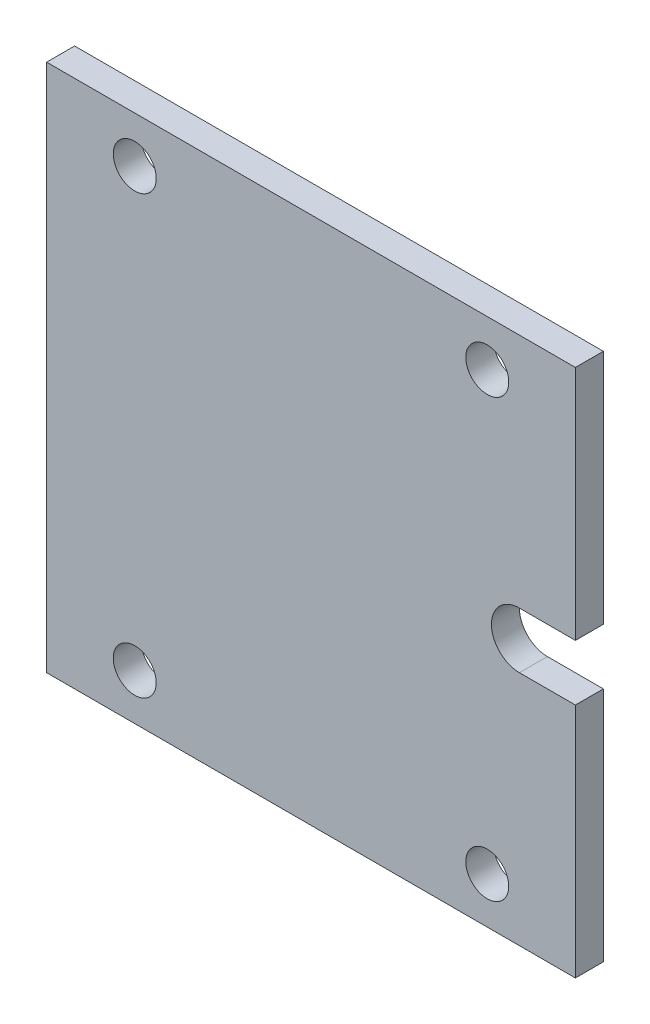
ISO-10303-21;
HEADER;
FILE_DESCRIPTION(('STEP AP214'),'2;1');
FILE_NAME('part.step','',(''),(''),'','','');
FILE_SCHEMA(('AUTOMOTIVE_DESIGN { 1 0 10303 214 1 1 1 1 }'));
ENDSEC;
DATA;
#1=APPLICATION_CONTEXT('core data for automotive mechanical design processes');
#2=APPLICATION_PROTOCOL_DEFINITION('international standard','automotive_design',2000,#1);
#3=PRODUCT_CONTEXT('',#1,'mechanical');
#4=PRODUCT('Part','Part','',(#3));
#5=PRODUCT_RELATED_PRODUCT_CATEGORY('part','',(#4));
#6=PRODUCT_DEFINITION_FORMATION('','',#4);
#7=PRODUCT_DEFINITION_CONTEXT('part definition',#1,'design');
#8=PRODUCT_DEFINITION('design','',#6,#7);
#9=PRODUCT_DEFINITION_SHAPE('','',#8);
#10=(LENGTH_UNIT() NAMED_UNIT(*) SI_UNIT(.MILLI.,.METRE.));
#11=(NAMED_UNIT(*) PLANE_ANGLE_UNIT() SI_UNIT($,.RADIAN.));
#12=(NAMED_UNIT(*) SI_UNIT($,.STERADIAN.) SOLID_ANGLE_UNIT());
#13=UNCERTAINTY_MEASURE_WITH_UNIT(LENGTH_MEASURE(1.E-05),#10,'distance_accuracy_value','');
#14=(GEOMETRIC_REPRESENTATION_CONTEXT(3) GLOBAL_UNCERTAINTY_ASSIGNED_CONTEXT((#13)) GLOBAL_UNIT_ASSIGNED_CONTEXT((#10,
#11,#12)) REPRESENTATION_CONTEXT('',''));
#15=CARTESIAN_POINT('',(0.,0.,0.));
#16=DIRECTION('',(0.,0.,1.));
#17=DIRECTION('',(1.,0.,0.));
#18=AXIS2_PLACEMENT_3D('',#15,#16,#17);
#19=CARTESIAN_POINT('',(15.,-15.,1.5875));
#20=DIRECTION('',(-1.,0.,0.));
#21=DIRECTION('',(0.,0.,1.));
#22=AXIS2_PLACEMENT_3D('',#19,#20,#21);
#23=PLANE('',#22);
#24=DIRECTION('',(0.,1.,0.));
#25=VECTOR('',#24,1.);
#26=CARTESIAN_POINT('',(15.,-15.,0.));
#27=LINE('',#26,#25);
#28=CARTESIAN_POINT('',(15.,-15.,0.));
#29=VERTEX_POINT('',#28);
#30=CARTESIAN_POINT('',(15.,-1.58749999999999,0.));
#31=VERTEX_POINT('',#30);
#32=EDGE_CURVE('E172',#29,#31,#27,.T.);
#33=ORIENTED_EDGE('',*,*,#32,.T.);
#34=DIRECTION('',(0.,0.,-1.));
#35=VECTOR('',#34,1.);
#36=CARTESIAN_POINT('',(15.,-1.58749999999999,1.5875));
#37=LINE('',#36,#35);
#38=CARTESIAN_POINT('',(15.,-1.58749999999999,1.5875));
#39=VERTEX_POINT('',#38);
#40=EDGE_CURVE('E137',#39,#31,#37,.T.);
#41=ORIENTED_EDGE('',*,*,#40,.F.);
#42=DIRECTION('',(0.,1.,0.));
#43=VECTOR('',#42,1.);
#44=CARTESIAN_POINT('',(15.,-15.,1.5875));
#45=LINE('',#44,#43);
#46=CARTESIAN_POINT('',(15.,-15.,1.5875));
#47=VERTEX_POINT('',#46);
#48=EDGE_CURVE('E164',#47,#39,#45,.T.);
#49=ORIENTED_EDGE('',*,*,#48,.F.);
#50=DIRECTION('',(0.,0.,-1.));
#51=VECTOR('',#50,1.);
#52=CARTESIAN_POINT('',(15.,-15.,1.5875));
#53=LINE('',#52,#51);
#54=EDGE_CURVE('E171',#47,#29,#53,.T.);
#55=ORIENTED_EDGE('',*,*,#54,.T.);
#56=EDGE_LOOP('',(#33,#41,#49,#55));
#57=FACE_BOUND('',#56,.T.);
#58=ADVANCED_FACE('F35',(#57),#23,.F.);
#59=CARTESIAN_POINT('',(0.,0.,1.5875));
#60=DIRECTION('',(0.,0.,-1.));
#61=DIRECTION('',(-1.,0.,0.));
#62=AXIS2_PLACEMENT_3D('',#59,#60,#61);
#63=PLANE('',#62);
#64=ORIENTED_EDGE('',*,*,#48,.T.);
#65=DIRECTION('',(-1.,0.,0.));
#66=VECTOR('',#65,1.);
#67=CARTESIAN_POINT('',(11.825,-1.58749999999999,1.5875));
#68=LINE('',#67,#66);
#69=CARTESIAN_POINT('',(11.825,-1.58749999999999,1.5875));
#70=VERTEX_POINT('',#69);
#71=EDGE_CURVE('E119',#39,#70,#68,.T.);
#72=ORIENTED_EDGE('',*,*,#71,.T.);
#73=CARTESIAN_POINT('',(11.825,0.,1.5875));
#74=DIRECTION('',(0.,0.,-1.));
#75=DIRECTION('',(-1.,0.,0.));
#76=AXIS2_PLACEMENT_3D('',#73,#74,#75);
#77=CIRCLE('',#76,1.5875);
#78=CARTESIAN_POINT('',(11.825,1.58750000000001,1.5875));
#79=VERTEX_POINT('',#78);
#80=EDGE_CURVE('E114',#70,#79,#77,.T.);
#81=ORIENTED_EDGE('',*,*,#80,.T.);
#82=DIRECTION('',(1.,0.,0.));
#83=VECTOR('',#82,1.);
#84=CARTESIAN_POINT('',(15.,1.58750000000002,1.5875));
#85=LINE('',#84,#83);
#86=CARTESIAN_POINT('',(15.,1.58750000000002,1.5875));
#87=VERTEX_POINT('',#86);
#88=EDGE_CURVE('E121',#79,#87,#85,.T.);
#89=ORIENTED_EDGE('',*,*,#88,.T.);
#90=CARTESIAN_POINT('',(15.,15.,1.5875));
#91=VERTEX_POINT('',#90);
#92=EDGE_CURVE('E87',#87,#91,#45,.T.);
#93=ORIENTED_EDGE('',*,*,#92,.T.);
#94=DIRECTION('',(-1.,0.,0.));
#95=VECTOR('',#94,1.);
#96=CARTESIAN_POINT('',(-15.,15.,1.5875));
#97=LINE('',#96,#95);
#98=CARTESIAN_POINT('',(-15.,15.,1.5875));
#99=VERTEX_POINT('',#98);
#100=EDGE_CURVE('E166',#91,#99,#97,.T.);
#101=ORIENTED_EDGE('',*,*,#100,.T.);
#102=DIRECTION('',(0.,-1.,0.));
#103=VECTOR('',#102,1.);
#104=CARTESIAN_POINT('',(-15.,-15.,1.5875));
#105=LINE('',#104,#103);
#106=CARTESIAN_POINT('',(-15.,-15.,1.5875));
#107=VERTEX_POINT('',#106);
#108=EDGE_CURVE('E168',#99,#107,#105,.T.);
#109=ORIENTED_EDGE('',*,*,#108,.T.);
#110=DIRECTION('',(1.,0.,0.));
#111=VECTOR('',#110,1.);
#112=CARTESIAN_POINT('',(-15.,-15.,1.5875));
#113=LINE('',#112,#111);
#114=EDGE_CURVE('E59',#107,#47,#113,.T.);
#115=ORIENTED_EDGE('',*,*,#114,.T.);
#116=EDGE_LOOP('',(#64,#72,#81,#89,#93,#101,#109,#115));
#117=FACE_BOUND('',#116,.T.);
#118=CARTESIAN_POINT('',(-10.,12.38905,1.5875));
#119=DIRECTION('',(0.,0.,1.));
#120=DIRECTION('',(1.,0.,0.));
#121=AXIS2_PLACEMENT_3D('',#118,#119,#120);
#122=CIRCLE('',#121,1.2192);
#123=CARTESIAN_POINT('',(-8.78080000000001,12.38905,1.5875));
#124=VERTEX_POINT('',#123);
#125=EDGE_CURVE('E158',#124,#124,#122,.T.);
#126=ORIENTED_EDGE('',*,*,#125,.F.);
#127=EDGE_LOOP('',(#126));
#128=FACE_BOUND('',#127,.T.);
#129=CARTESIAN_POINT('',(9.99999999999999,12.38905,1.5875));
#130=DIRECTION('',(0.,0.,1.));
#131=DIRECTION('',(1.,0.,0.));
#132=AXIS2_PLACEMENT_3D('',#129,#130,#131);
#133=CIRCLE('',#132,1.2192);
#134=CARTESIAN_POINT('',(11.2192,12.38905,1.5875));
#135=VERTEX_POINT('',#134);
#136=EDGE_CURVE('E152',#135,#135,#133,.T.);
#137=ORIENTED_EDGE('',*,*,#136,.F.);
#138=EDGE_LOOP('',(#137));
#139=FACE_BOUND('',#138,.T.);
#140=CARTESIAN_POINT('',(9.99999999999999,-12.3890499999999,1.5875));
#141=DIRECTION('',(0.,0.,1.));
#142=DIRECTION('',(1.,0.,0.));
#143=AXIS2_PLACEMENT_3D('',#140,#141,#142);
#144=CIRCLE('',#143,1.2192);
#145=CARTESIAN_POINT('',(11.2192,-12.3890499999999,1.5875));
#146=VERTEX_POINT('',#145);
#147=EDGE_CURVE('E146',#146,#146,#144,.T.);
#148=ORIENTED_EDGE('',*,*,#147,.F.);
#149=EDGE_LOOP('',(#148));
#150=FACE_BOUND('',#149,.T.);
#151=CARTESIAN_POINT('',(-10.,-12.3890499999999,1.5875));
#152=DIRECTION('',(0.,0.,1.));
#153=DIRECTION('',(1.,0.,0.));
#154=AXIS2_PLACEMENT_3D('',#151,#152,#153);
#155=CIRCLE('',#154,1.2192);
#156=CARTESIAN_POINT('',(-8.78080000000001,-12.3890499999999,1.5875));
#157=VERTEX_POINT('',#156);
#158=EDGE_CURVE('E140',#157,#157,#155,.T.);
#159=ORIENTED_EDGE('',*,*,#158,.F.);
#160=EDGE_LOOP('',(#159));
#161=FACE_BOUND('',#160,.T.);
#162=ADVANCED_FACE('F124',(#117,#128,#139,#150,#161),#63,.F.);
#163=CARTESIAN_POINT('',(0.,0.,0.));
#164=DIRECTION('',(0.,0.,-1.));
#165=DIRECTION('',(-1.,0.,0.));
#166=AXIS2_PLACEMENT_3D('',#163,#164,#165);
#167=PLANE('',#166);
#168=DIRECTION('',(-1.,0.,0.));
#169=VECTOR('',#168,1.);
#170=CARTESIAN_POINT('',(11.825,-1.58749999999999,0.));
#171=LINE('',#170,#169);
#172=CARTESIAN_POINT('',(11.825,-1.58749999999999,0.));
#173=VERTEX_POINT('',#172);
#174=EDGE_CURVE('E126',#31,#173,#171,.T.);
#175=ORIENTED_EDGE('',*,*,#174,.F.);
#176=ORIENTED_EDGE('',*,*,#32,.F.);
#177=DIRECTION('',(1.,0.,0.));
#178=VECTOR('',#177,1.);
#179=CARTESIAN_POINT('',(-15.,-15.,0.));
#180=LINE('',#179,#178);
#181=CARTESIAN_POINT('',(-15.,-15.,0.));
#182=VERTEX_POINT('',#181);
#183=EDGE_CURVE('E80',#182,#29,#180,.T.);
#184=ORIENTED_EDGE('',*,*,#183,.F.);
#185=DIRECTION('',(0.,-1.,0.));
#186=VECTOR('',#185,1.);
#187=CARTESIAN_POINT('',(-15.,-15.,0.));
#188=LINE('',#187,#186);
#189=CARTESIAN_POINT('',(-15.,15.,0.));
#190=VERTEX_POINT('',#189);
#191=EDGE_CURVE('E177',#190,#182,#188,.T.);
#192=ORIENTED_EDGE('',*,*,#191,.F.);
#193=DIRECTION('',(-1.,0.,0.));
#194=VECTOR('',#193,1.);
#195=CARTESIAN_POINT('',(-15.,15.,0.));
#196=LINE('',#195,#194);
#197=CARTESIAN_POINT('',(15.,15.,0.));
#198=VERTEX_POINT('',#197);
#199=EDGE_CURVE('E175',#198,#190,#196,.T.);
#200=ORIENTED_EDGE('',*,*,#199,.F.);
#201=CARTESIAN_POINT('',(15.,1.58750000000001,0.));
#202=VERTEX_POINT('',#201);
#203=EDGE_CURVE('E161',#202,#198,#27,.T.);
#204=ORIENTED_EDGE('',*,*,#203,.F.);
#205=DIRECTION('',(1.,0.,0.));
#206=VECTOR('',#205,1.);
#207=CARTESIAN_POINT('',(15.,1.58750000000002,0.));
#208=LINE('',#207,#206);
#209=CARTESIAN_POINT('',(11.825,1.58750000000001,0.));
#210=VERTEX_POINT('',#209);
#211=EDGE_CURVE('E50',#210,#202,#208,.T.);
#212=ORIENTED_EDGE('',*,*,#211,.F.);
#213=CARTESIAN_POINT('',(11.825,0.,0.));
#214=DIRECTION('',(0.,0.,-1.));
#215=DIRECTION('',(-1.,0.,0.));
#216=AXIS2_PLACEMENT_3D('',#213,#214,#215);
#217=CIRCLE('',#216,1.5875);
#218=EDGE_CURVE('E117',#173,#210,#217,.T.);
#219=ORIENTED_EDGE('',*,*,#218,.F.);
#220=EDGE_LOOP('',(#175,#176,#184,#192,#200,#204,#212,#219));
#221=FACE_BOUND('',#220,.T.);
#222=CARTESIAN_POINT('',(9.99999999999999,-12.3890499999999,0.));
#223=DIRECTION('',(0.,0.,1.));
#224=DIRECTION('',(1.,0.,0.));
#225=AXIS2_PLACEMENT_3D('',#222,#223,#224);
#226=CIRCLE('',#225,1.2192);
#227=CARTESIAN_POINT('',(11.2192,-12.3890499999999,0.));
#228=VERTEX_POINT('',#227);
#229=EDGE_CURVE('E143',#228,#228,#226,.T.);
#230=ORIENTED_EDGE('',*,*,#229,.T.);
#231=EDGE_LOOP('',(#230));
#232=FACE_BOUND('',#231,.T.);
#233=CARTESIAN_POINT('',(-10.,12.38905,0.));
#234=DIRECTION('',(0.,0.,1.));
#235=DIRECTION('',(1.,0.,0.));
#236=AXIS2_PLACEMENT_3D('',#233,#234,#235);
#237=CIRCLE('',#236,1.2192);
#238=CARTESIAN_POINT('',(-8.78080000000001,12.38905,0.));
#239=VERTEX_POINT('',#238);
#240=EDGE_CURVE('E155',#239,#239,#237,.T.);
#241=ORIENTED_EDGE('',*,*,#240,.T.);
#242=EDGE_LOOP('',(#241));
#243=FACE_BOUND('',#242,.T.);
#244=CARTESIAN_POINT('',(9.99999999999999,12.38905,0.));
#245=DIRECTION('',(0.,0.,1.));
#246=DIRECTION('',(1.,0.,0.));
#247=AXIS2_PLACEMENT_3D('',#244,#245,#246);
#248=CIRCLE('',#247,1.2192);
#249=CARTESIAN_POINT('',(11.2192,12.38905,0.));
#250=VERTEX_POINT('',#249);
#251=EDGE_CURVE('E149',#250,#250,#248,.T.);
#252=ORIENTED_EDGE('',*,*,#251,.T.);
#253=EDGE_LOOP('',(#252));
#254=FACE_BOUND('',#253,.T.);
#255=CARTESIAN_POINT('',(-10.,-12.3890499999999,0.));
#256=DIRECTION('',(0.,0.,1.));
#257=DIRECTION('',(1.,0.,0.));
#258=AXIS2_PLACEMENT_3D('',#255,#256,#257);
#259=CIRCLE('',#258,1.2192);
#260=CARTESIAN_POINT('',(-8.78080000000001,-12.3890499999999,0.));
#261=VERTEX_POINT('',#260);
#262=EDGE_CURVE('E136',#261,#261,#259,.T.);
#263=ORIENTED_EDGE('',*,*,#262,.T.);
#264=EDGE_LOOP('',(#263));
#265=FACE_BOUND('',#264,.T.);
#266=ADVANCED_FACE('F193',(#221,#232,#243,#254,#265),#167,.T.);
#267=ORIENTED_EDGE('',*,*,#92,.F.);
#268=DIRECTION('',(0.,0.,-1.));
#269=VECTOR('',#268,1.);
#270=CARTESIAN_POINT('',(15.,1.58750000000002,1.5875));
#271=LINE('',#270,#269);
#272=EDGE_CURVE('E118',#87,#202,#271,.T.);
#273=ORIENTED_EDGE('',*,*,#272,.T.);
#274=ORIENTED_EDGE('',*,*,#203,.T.);
#275=DIRECTION('',(0.,0.,-1.));
#276=VECTOR('',#275,1.);
#277=CARTESIAN_POINT('',(15.,15.,1.5875));
#278=LINE('',#277,#276);
#279=EDGE_CURVE('E11',#91,#198,#278,.T.);
#280=ORIENTED_EDGE('',*,*,#279,.F.);
#281=EDGE_LOOP('',(#267,#273,#274,#280));
#282=FACE_BOUND('',#281,.T.);
#283=ADVANCED_FACE('F37',(#282),#23,.F.);
#284=CARTESIAN_POINT('',(-15.,15.,1.5875));
#285=DIRECTION('',(0.,-1.,0.));
#286=DIRECTION('',(0.,0.,-1.));
#287=AXIS2_PLACEMENT_3D('',#284,#285,#286);
#288=PLANE('',#287);
#289=ORIENTED_EDGE('',*,*,#199,.T.);
#290=DIRECTION('',(0.,0.,-1.));
#291=VECTOR('',#290,1.);
#292=CARTESIAN_POINT('',(-15.,15.,1.5875));
#293=LINE('',#292,#291);
#294=EDGE_CURVE('E43',#99,#190,#293,.T.);
#295=ORIENTED_EDGE('',*,*,#294,.F.);
#296=ORIENTED_EDGE('',*,*,#100,.F.);
#297=ORIENTED_EDGE('',*,*,#279,.T.);
#298=EDGE_LOOP('',(#289,#295,#296,#297));
#299=FACE_BOUND('',#298,.T.);
#300=ADVANCED_FACE('F211',(#299),#288,.F.);
#301=CARTESIAN_POINT('',(-15.,-15.,1.5875));
#302=DIRECTION('',(1.,0.,0.));
#303=DIRECTION('',(0.,0.,-1.));
#304=AXIS2_PLACEMENT_3D('',#301,#302,#303);
#305=PLANE('',#304);
#306=ORIENTED_EDGE('',*,*,#191,.T.);
#307=DIRECTION('',(0.,0.,-1.));
#308=VECTOR('',#307,1.);
#309=CARTESIAN_POINT('',(-15.,-15.,1.5875));
#310=LINE('',#309,#308);
#311=EDGE_CURVE('E181',#107,#182,#310,.T.);
#312=ORIENTED_EDGE('',*,*,#311,.F.);
#313=ORIENTED_EDGE('',*,*,#108,.F.);
#314=ORIENTED_EDGE('',*,*,#294,.T.);
#315=EDGE_LOOP('',(#306,#312,#313,#314));
#316=FACE_BOUND('',#315,.T.);
#317=ADVANCED_FACE('F187',(#316),#305,.F.);
#318=CARTESIAN_POINT('',(-15.,-15.,1.5875));
#319=DIRECTION('',(0.,1.,0.));
#320=DIRECTION('',(0.,0.,1.));
#321=AXIS2_PLACEMENT_3D('',#318,#319,#320);
#322=PLANE('',#321);
#323=ORIENTED_EDGE('',*,*,#183,.T.);
#324=ORIENTED_EDGE('',*,*,#54,.F.);
#325=ORIENTED_EDGE('',*,*,#114,.F.);
#326=ORIENTED_EDGE('',*,*,#311,.T.);
#327=EDGE_LOOP('',(#323,#324,#325,#326));
#328=FACE_BOUND('',#327,.T.);
#329=ADVANCED_FACE('F200',(#328),#322,.F.);
#330=CARTESIAN_POINT('',(-10.,12.38905,1.5875));
#331=DIRECTION('',(0.,0.,-1.));
#332=DIRECTION('',(-1.,0.,0.));
#333=AXIS2_PLACEMENT_3D('',#330,#331,#332);
#334=CYLINDRICAL_SURFACE('',#333,1.2192);
#335=ORIENTED_EDGE('',*,*,#125,.T.);
#336=EDGE_LOOP('',(#335));
#337=FACE_BOUND('',#336,.T.);
#338=ORIENTED_EDGE('',*,*,#240,.F.);
#339=EDGE_LOOP('',(#338));
#340=FACE_BOUND('',#339,.T.);
#341=ADVANCED_FACE('F202',(#337,#340),#334,.F.);
#342=CARTESIAN_POINT('',(9.99999999999999,12.38905,1.5875));
#343=DIRECTION('',(0.,0.,-1.));
#344=DIRECTION('',(-1.,0.,0.));
#345=AXIS2_PLACEMENT_3D('',#342,#343,#344);
#346=CYLINDRICAL_SURFACE('',#345,1.2192);
#347=ORIENTED_EDGE('',*,*,#136,.T.);
#348=EDGE_LOOP('',(#347));
#349=FACE_BOUND('',#348,.T.);
#350=ORIENTED_EDGE('',*,*,#251,.F.);
#351=EDGE_LOOP('',(#350));
#352=FACE_BOUND('',#351,.T.);
#353=ADVANCED_FACE('F208',(#349,#352),#346,.F.);
#354=CARTESIAN_POINT('',(9.99999999999999,-12.3890499999999,1.5875));
#355=DIRECTION('',(0.,0.,-1.));
#356=DIRECTION('',(-1.,0.,0.));
#357=AXIS2_PLACEMENT_3D('',#354,#355,#356);
#358=CYLINDRICAL_SURFACE('',#357,1.2192);
#359=ORIENTED_EDGE('',*,*,#147,.T.);
#360=EDGE_LOOP('',(#359));
#361=FACE_BOUND('',#360,.T.);
#362=ORIENTED_EDGE('',*,*,#229,.F.);
#363=EDGE_LOOP('',(#362));
#364=FACE_BOUND('',#363,.T.);
#365=ADVANCED_FACE('F231',(#361,#364),#358,.F.);
#366=CARTESIAN_POINT('',(-10.,-12.3890499999999,1.5875));
#367=DIRECTION('',(0.,0.,-1.));
#368=DIRECTION('',(-1.,0.,0.));
#369=AXIS2_PLACEMENT_3D('',#366,#367,#368);
#370=CYLINDRICAL_SURFACE('',#369,1.2192);
#371=ORIENTED_EDGE('',*,*,#158,.T.);
#372=EDGE_LOOP('',(#371));
#373=FACE_BOUND('',#372,.T.);
#374=ORIENTED_EDGE('',*,*,#262,.F.);
#375=EDGE_LOOP('',(#374));
#376=FACE_BOUND('',#375,.T.);
#377=ADVANCED_FACE('F235',(#373,#376),#370,.F.);
#378=CARTESIAN_POINT('',(11.825,0.,1.5875));
#379=DIRECTION('',(0.,0.,-1.));
#380=DIRECTION('',(-1.,0.,0.));
#381=AXIS2_PLACEMENT_3D('',#378,#379,#380);
#382=CYLINDRICAL_SURFACE('',#381,1.5875);
#383=ORIENTED_EDGE('',*,*,#218,.T.);
#384=DIRECTION('',(0.,0.,-1.));
#385=VECTOR('',#384,1.);
#386=CARTESIAN_POINT('',(11.825,1.58750000000001,1.5875));
#387=LINE('',#386,#385);
#388=EDGE_CURVE('E110',#79,#210,#387,.T.);
#389=ORIENTED_EDGE('',*,*,#388,.F.);
#390=ORIENTED_EDGE('',*,*,#80,.F.);
#391=DIRECTION('',(0.,0.,-1.));
#392=VECTOR('',#391,1.);
#393=CARTESIAN_POINT('',(11.825,-1.58749999999999,1.5875));
#394=LINE('',#393,#392);
#395=EDGE_CURVE('E134',#70,#173,#394,.T.);
#396=ORIENTED_EDGE('',*,*,#395,.T.);
#397=EDGE_LOOP('',(#383,#389,#390,#396));
#398=FACE_BOUND('',#397,.T.);
#399=ADVANCED_FACE('F112',(#398),#382,.F.);
#400=CARTESIAN_POINT('',(11.825,-1.58749999999999,1.5875));
#401=DIRECTION('',(0.,-1.,0.));
#402=DIRECTION('',(1.,0.,0.));
#403=AXIS2_PLACEMENT_3D('',#400,#401,#402);
#404=PLANE('',#403);
#405=ORIENTED_EDGE('',*,*,#174,.T.);
#406=ORIENTED_EDGE('',*,*,#395,.F.);
#407=ORIENTED_EDGE('',*,*,#71,.F.);
#408=ORIENTED_EDGE('',*,*,#40,.T.);
#409=EDGE_LOOP('',(#405,#406,#407,#408));
#410=FACE_BOUND('',#409,.T.);
#411=ADVANCED_FACE('F242',(#410),#404,.F.);
#412=CARTESIAN_POINT('',(15.,1.58750000000002,1.5875));
#413=DIRECTION('',(0.,1.,0.));
#414=DIRECTION('',(-1.,0.,0.));
#415=AXIS2_PLACEMENT_3D('',#412,#413,#414);
#416=PLANE('',#415);
#417=ORIENTED_EDGE('',*,*,#211,.T.);
#418=ORIENTED_EDGE('',*,*,#272,.F.);
#419=ORIENTED_EDGE('',*,*,#88,.F.);
#420=ORIENTED_EDGE('',*,*,#388,.T.);
#421=EDGE_LOOP('',(#417,#418,#419,#420));
#422=FACE_BOUND('',#421,.T.);
#423=ADVANCED_FACE('F122',(#422),#416,.F.);
#424=CLOSED_SHELL('',(#58,#162,#266,#283,#300,#317,#329,#341,#353,#365,#377,#399,#411,#423));
#425=MANIFOLD_SOLID_BREP('B2',#424);
#426=ADVANCED_BREP_SHAPE_REPRESENTATION('',(#18,#425),#14);
#427=SHAPE_DEFINITION_REPRESENTATION(#9,#426);
ENDSEC;
END-ISO-10303-21;
